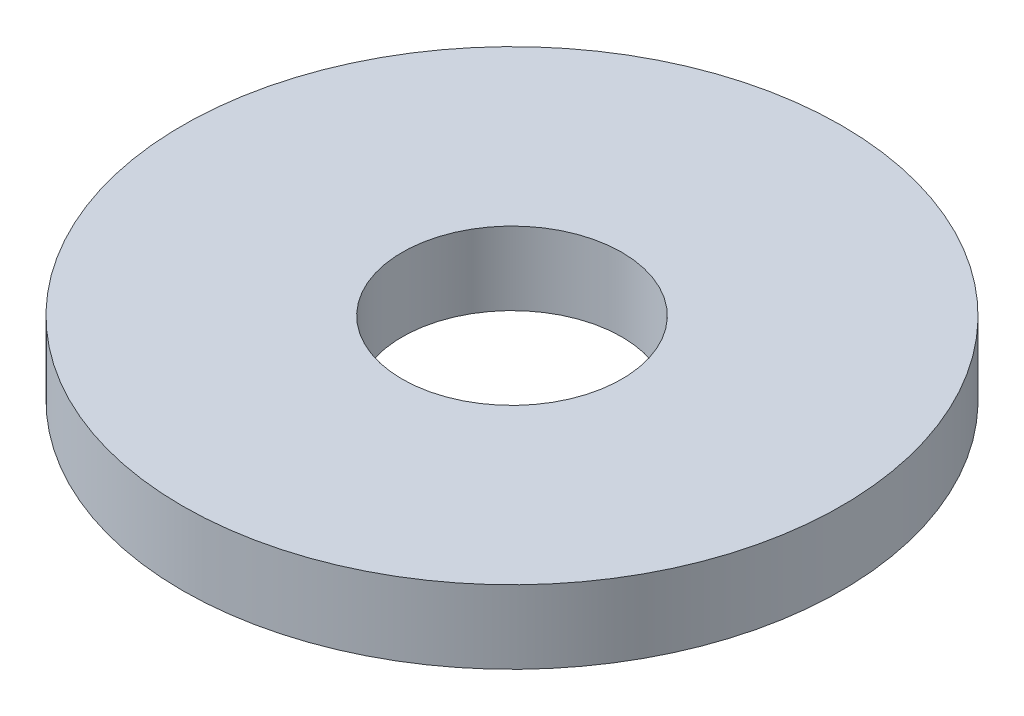
ISO-10303-21;
HEADER;
FILE_DESCRIPTION(('STEP AP214'),'2;1');
FILE_NAME('part.step','',(''),(''),'','','');
FILE_SCHEMA(('AUTOMOTIVE_DESIGN { 1 0 10303 214 1 1 1 1 }'));
ENDSEC;
DATA;
#1=APPLICATION_CONTEXT('core data for automotive mechanical design processes');
#2=APPLICATION_PROTOCOL_DEFINITION('international standard','automotive_design',2000,#1);
#3=PRODUCT_CONTEXT('',#1,'mechanical');
#4=PRODUCT('Part','Part','',(#3));
#5=PRODUCT_RELATED_PRODUCT_CATEGORY('part','',(#4));
#6=PRODUCT_DEFINITION_FORMATION('','',#4);
#7=PRODUCT_DEFINITION_CONTEXT('part definition',#1,'design');
#8=PRODUCT_DEFINITION('design','',#6,#7);
#9=PRODUCT_DEFINITION_SHAPE('','',#8);
#10=(LENGTH_UNIT() NAMED_UNIT(*) SI_UNIT(.MILLI.,.METRE.));
#11=(NAMED_UNIT(*) PLANE_ANGLE_UNIT() SI_UNIT($,.RADIAN.));
#12=(NAMED_UNIT(*) SI_UNIT($,.STERADIAN.) SOLID_ANGLE_UNIT());
#13=UNCERTAINTY_MEASURE_WITH_UNIT(LENGTH_MEASURE(1.E-05),#10,'distance_accuracy_value','');
#14=(GEOMETRIC_REPRESENTATION_CONTEXT(3) GLOBAL_UNCERTAINTY_ASSIGNED_CONTEXT((#13)) GLOBAL_UNIT_ASSIGNED_CONTEXT((#10,
#11,#12)) REPRESENTATION_CONTEXT('',''));
#15=CARTESIAN_POINT('',(0.,0.,0.));
#16=DIRECTION('',(0.,0.,1.));
#17=DIRECTION('',(1.,0.,0.));
#18=AXIS2_PLACEMENT_3D('',#15,#16,#17);
#19=CARTESIAN_POINT('',(0.,1.,0.));
#20=DIRECTION('',(0.,1.,0.));
#21=DIRECTION('',(0.,0.,1.));
#22=AXIS2_PLACEMENT_3D('',#19,#20,#21);
#23=PLANE('',#22);
#24=CARTESIAN_POINT('',(0.,1.,0.));
#25=DIRECTION('',(0.,1.,0.));
#26=DIRECTION('',(0.,0.,1.));
#27=AXIS2_PLACEMENT_3D('',#24,#25,#26);
#28=CIRCLE('',#27,4.5);
#29=CARTESIAN_POINT('',(0.,1.,4.5));
#30=VERTEX_POINT('',#29);
#31=EDGE_CURVE('E10',#30,#30,#28,.T.);
#32=ORIENTED_EDGE('',*,*,#31,.T.);
#33=EDGE_LOOP('',(#32));
#34=FACE_BOUND('',#33,.T.);
#35=CARTESIAN_POINT('',(0.,1.,0.));
#36=DIRECTION('',(0.,1.,0.));
#37=DIRECTION('',(0.,0.,1.));
#38=AXIS2_PLACEMENT_3D('',#35,#36,#37);
#39=CIRCLE('',#38,1.5);
#40=CARTESIAN_POINT('',(0.,1.,1.5));
#41=VERTEX_POINT('',#40);
#42=EDGE_CURVE('E41',#41,#41,#39,.T.);
#43=ORIENTED_EDGE('',*,*,#42,.F.);
#44=EDGE_LOOP('',(#43));
#45=FACE_BOUND('',#44,.T.);
#46=ADVANCED_FACE('F30',(#34,#45),#23,.T.);
#47=CARTESIAN_POINT('',(0.,0.,0.));
#48=DIRECTION('',(0.,1.,0.));
#49=DIRECTION('',(0.,0.,1.));
#50=AXIS2_PLACEMENT_3D('',#47,#48,#49);
#51=PLANE('',#50);
#52=CARTESIAN_POINT('',(0.,0.,0.));
#53=DIRECTION('',(0.,1.,0.));
#54=DIRECTION('',(0.,0.,1.));
#55=AXIS2_PLACEMENT_3D('',#52,#53,#54);
#56=CIRCLE('',#55,4.5);
#57=CARTESIAN_POINT('',(0.,0.,4.5));
#58=VERTEX_POINT('',#57);
#59=EDGE_CURVE('E34',#58,#58,#56,.T.);
#60=ORIENTED_EDGE('',*,*,#59,.F.);
#61=EDGE_LOOP('',(#60));
#62=FACE_BOUND('',#61,.T.);
#63=CARTESIAN_POINT('',(0.,0.,0.));
#64=DIRECTION('',(0.,1.,0.));
#65=DIRECTION('',(0.,0.,1.));
#66=AXIS2_PLACEMENT_3D('',#63,#64,#65);
#67=CIRCLE('',#66,1.5);
#68=CARTESIAN_POINT('',(0.,0.,1.5));
#69=VERTEX_POINT('',#68);
#70=EDGE_CURVE('E43',#69,#69,#67,.T.);
#71=ORIENTED_EDGE('',*,*,#70,.T.);
#72=EDGE_LOOP('',(#71));
#73=FACE_BOUND('',#72,.T.);
#74=ADVANCED_FACE('F53',(#62,#73),#51,.F.);
#75=CARTESIAN_POINT('',(0.,1.,0.));
#76=DIRECTION('',(0.,-1.,0.));
#77=DIRECTION('',(0.,0.,-1.));
#78=AXIS2_PLACEMENT_3D('',#75,#76,#77);
#79=CYLINDRICAL_SURFACE('',#78,4.5);
#80=ORIENTED_EDGE('',*,*,#31,.F.);
#81=EDGE_LOOP('',(#80));
#82=FACE_BOUND('',#81,.T.);
#83=ORIENTED_EDGE('',*,*,#59,.T.);
#84=EDGE_LOOP('',(#83));
#85=FACE_BOUND('',#84,.T.);
#86=ADVANCED_FACE('F32',(#82,#85),#79,.T.);
#87=CARTESIAN_POINT('',(0.,1.,0.));
#88=DIRECTION('',(0.,-1.,0.));
#89=DIRECTION('',(0.,0.,-1.));
#90=AXIS2_PLACEMENT_3D('',#87,#88,#89);
#91=CYLINDRICAL_SURFACE('',#90,1.5);
#92=ORIENTED_EDGE('',*,*,#42,.T.);
#93=EDGE_LOOP('',(#92));
#94=FACE_BOUND('',#93,.T.);
#95=ORIENTED_EDGE('',*,*,#70,.F.);
#96=EDGE_LOOP('',(#95));
#97=FACE_BOUND('',#96,.T.);
#98=ADVANCED_FACE('F49',(#94,#97),#91,.F.);
#99=CLOSED_SHELL('',(#46,#74,#86,#98));
#100=MANIFOLD_SOLID_BREP('B2',#99);
#101=ADVANCED_BREP_SHAPE_REPRESENTATION('',(#18,#100),#14);
#102=SHAPE_DEFINITION_REPRESENTATION(#9,#101);
ENDSEC;
END-ISO-10303-21;
